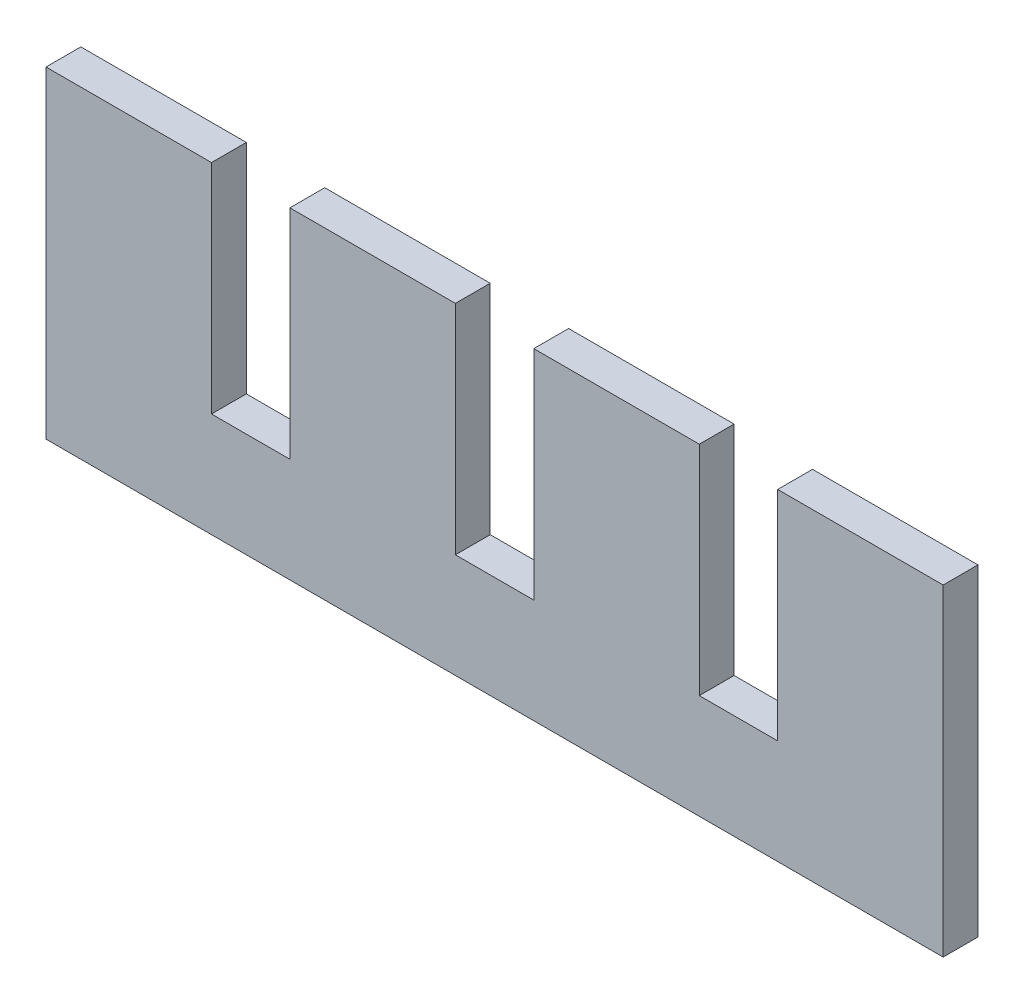
ISO-10303-21;
HEADER;
FILE_DESCRIPTION(('STEP AP214'),'2;1');
FILE_NAME('part.step','',(''),(''),'','','');
FILE_SCHEMA(('AUTOMOTIVE_DESIGN { 1 0 10303 214 1 1 1 1 }'));
ENDSEC;
DATA;
#1=APPLICATION_CONTEXT('core data for automotive mechanical design processes');
#2=APPLICATION_PROTOCOL_DEFINITION('international standard','automotive_design',2000,#1);
#3=PRODUCT_CONTEXT('',#1,'mechanical');
#4=PRODUCT('Part','Part','',(#3));
#5=PRODUCT_RELATED_PRODUCT_CATEGORY('part','',(#4));
#6=PRODUCT_DEFINITION_FORMATION('','',#4);
#7=PRODUCT_DEFINITION_CONTEXT('part definition',#1,'design');
#8=PRODUCT_DEFINITION('design','',#6,#7);
#9=PRODUCT_DEFINITION_SHAPE('','',#8);
#10=(LENGTH_UNIT() NAMED_UNIT(*) SI_UNIT(.MILLI.,.METRE.));
#11=(NAMED_UNIT(*) PLANE_ANGLE_UNIT() SI_UNIT($,.RADIAN.));
#12=(NAMED_UNIT(*) SI_UNIT($,.STERADIAN.) SOLID_ANGLE_UNIT());
#13=UNCERTAINTY_MEASURE_WITH_UNIT(LENGTH_MEASURE(1.E-05),#10,'distance_accuracy_value','');
#14=(GEOMETRIC_REPRESENTATION_CONTEXT(3) GLOBAL_UNCERTAINTY_ASSIGNED_CONTEXT((#13)) GLOBAL_UNIT_ASSIGNED_CONTEXT((#10,
#11,#12)) REPRESENTATION_CONTEXT('',''));
#15=CARTESIAN_POINT('',(0.,0.,0.));
#16=DIRECTION('',(0.,0.,1.));
#17=DIRECTION('',(1.,0.,0.));
#18=AXIS2_PLACEMENT_3D('',#15,#16,#17);
#19=CARTESIAN_POINT('',(6.55,3.7,0.25));
#20=DIRECTION('',(0.,1.,0.));
#21=DIRECTION('',(1.,0.,0.));
#22=AXIS2_PLACEMENT_3D('',#19,#20,#21);
#23=PLANE('',#22);
#24=DIRECTION('',(0.,0.,-1.));
#25=VECTOR('',#24,1.);
#26=CARTESIAN_POINT('',(7.5,3.7,0.45));
#27=LINE('',#26,#25);
#28=CARTESIAN_POINT('',(7.5,3.7,0.45));
#29=VERTEX_POINT('',#28);
#30=CARTESIAN_POINT('',(7.50000000024103,3.7,0.05));
#31=VERTEX_POINT('',#30);
#32=EDGE_CURVE('E11',#29,#31,#27,.T.);
#33=ORIENTED_EDGE('',*,*,#32,.T.);
#34=DIRECTION('',(-1.,0.,0.));
#35=VECTOR('',#34,1.);
#36=CARTESIAN_POINT('',(7.50000000022217,3.7,0.05));
#37=LINE('',#36,#35);
#38=CARTESIAN_POINT('',(5.6,3.7,0.05));
#39=VERTEX_POINT('',#38);
#40=EDGE_CURVE('E310',#31,#39,#37,.T.);
#41=ORIENTED_EDGE('',*,*,#40,.T.);
#42=DIRECTION('',(0.,0.,1.));
#43=VECTOR('',#42,1.);
#44=CARTESIAN_POINT('',(5.6,3.7,0.05));
#45=LINE('',#44,#43);
#46=CARTESIAN_POINT('',(5.599999999407,3.7,0.45));
#47=VERTEX_POINT('',#46);
#48=EDGE_CURVE('E275',#39,#47,#45,.T.);
#49=ORIENTED_EDGE('',*,*,#48,.T.);
#50=DIRECTION('',(1.,0.,0.));
#51=VECTOR('',#50,1.);
#52=CARTESIAN_POINT('',(5.599999999407,3.7,0.45));
#53=LINE('',#52,#51);
#54=EDGE_CURVE('E269',#47,#29,#53,.T.);
#55=ORIENTED_EDGE('',*,*,#54,.T.);
#56=EDGE_LOOP('',(#33,#41,#49,#55));
#57=FACE_BOUND('',#56,.T.);
#58=ADVANCED_FACE('F17',(#57),#23,.T.);
#59=CARTESIAN_POINT('',(7.5,2.45,0.25));
#60=DIRECTION('',(1.,0.,0.));
#61=DIRECTION('',(0.,1.,0.));
#62=AXIS2_PLACEMENT_3D('',#59,#60,#61);
#63=PLANE('',#62);
#64=DIRECTION('',(0.,1.,0.));
#65=VECTOR('',#64,1.);
#66=CARTESIAN_POINT('',(7.5,1.19999999984411,0.45));
#67=LINE('',#66,#65);
#68=CARTESIAN_POINT('',(7.50000000020336,1.2,0.45));
#69=VERTEX_POINT('',#68);
#70=EDGE_CURVE('E259',#69,#29,#67,.T.);
#71=ORIENTED_EDGE('',*,*,#70,.F.);
#72=DIRECTION('',(0.,0.,-1.));
#73=VECTOR('',#72,1.);
#74=CARTESIAN_POINT('',(7.50000000018489,1.2,0.45));
#75=LINE('',#74,#73);
#76=CARTESIAN_POINT('',(7.5,1.19999999985539,0.05));
#77=VERTEX_POINT('',#76);
#78=EDGE_CURVE('E26',#69,#77,#75,.T.);
#79=ORIENTED_EDGE('',*,*,#78,.T.);
#80=DIRECTION('',(0.,-1.,0.));
#81=VECTOR('',#80,1.);
#82=CARTESIAN_POINT('',(7.5,3.7,0.05));
#83=LINE('',#82,#81);
#84=EDGE_CURVE('E313',#31,#77,#83,.T.);
#85=ORIENTED_EDGE('',*,*,#84,.F.);
#86=ORIENTED_EDGE('',*,*,#32,.F.);
#87=EDGE_LOOP('',(#71,#79,#85,#86));
#88=FACE_BOUND('',#87,.T.);
#89=ADVANCED_FACE('F19',(#88),#63,.T.);
#90=CARTESIAN_POINT('',(7.95,1.2,0.25));
#91=DIRECTION('',(0.,1.,0.));
#92=DIRECTION('',(1.,0.,0.));
#93=AXIS2_PLACEMENT_3D('',#90,#91,#92);
#94=PLANE('',#93);
#95=DIRECTION('',(-1.,0.,0.));
#96=VECTOR('',#95,1.);
#97=CARTESIAN_POINT('',(8.400000000637,1.2,0.45));
#98=LINE('',#97,#96);
#99=CARTESIAN_POINT('',(8.4,1.19999999987772,0.45));
#100=VERTEX_POINT('',#99);
#101=EDGE_CURVE('E211',#100,#69,#98,.T.);
#102=ORIENTED_EDGE('',*,*,#101,.F.);
#103=DIRECTION('',(0.,0.,-1.));
#104=VECTOR('',#103,1.);
#105=CARTESIAN_POINT('',(8.4,1.19999999988911,0.45));
#106=LINE('',#105,#104);
#107=CARTESIAN_POINT('',(8.400000000637,1.2,0.05));
#108=VERTEX_POINT('',#107);
#109=EDGE_CURVE('E224',#100,#108,#106,.T.);
#110=ORIENTED_EDGE('',*,*,#109,.T.);
#111=DIRECTION('',(1.,0.,0.));
#112=VECTOR('',#111,1.);
#113=CARTESIAN_POINT('',(7.50000000018489,1.2,0.05));
#114=LINE('',#113,#112);
#115=EDGE_CURVE('E317',#77,#108,#114,.T.);
#116=ORIENTED_EDGE('',*,*,#115,.F.);
#117=ORIENTED_EDGE('',*,*,#78,.F.);
#118=EDGE_LOOP('',(#102,#110,#116,#117));
#119=FACE_BOUND('',#118,.T.);
#120=ADVANCED_FACE('F373',(#119),#94,.T.);
#121=CARTESIAN_POINT('',(8.4,2.45,0.25));
#122=DIRECTION('',(1.,0.,0.));
#123=DIRECTION('',(0.,1.,0.));
#124=AXIS2_PLACEMENT_3D('',#121,#122,#123);
#125=PLANE('',#124);
#126=DIRECTION('',(0.,-1.,0.));
#127=VECTOR('',#126,1.);
#128=CARTESIAN_POINT('',(8.4,3.7,0.45));
#129=LINE('',#128,#127);
#130=CARTESIAN_POINT('',(8.400000000637,3.7,0.45));
#131=VERTEX_POINT('',#130);
#132=EDGE_CURVE('E208',#131,#100,#129,.T.);
#133=ORIENTED_EDGE('',*,*,#132,.F.);
#134=DIRECTION('',(0.,0.,1.));
#135=VECTOR('',#134,1.);
#136=CARTESIAN_POINT('',(8.4,3.7,0.05));
#137=LINE('',#136,#135);
#138=CARTESIAN_POINT('',(8.4,3.7,0.05));
#139=VERTEX_POINT('',#138);
#140=EDGE_CURVE('E221',#139,#131,#137,.T.);
#141=ORIENTED_EDGE('',*,*,#140,.F.);
#142=DIRECTION('',(0.,1.,0.));
#143=VECTOR('',#142,1.);
#144=CARTESIAN_POINT('',(8.4,1.19999999988911,0.05));
#145=LINE('',#144,#143);
#146=EDGE_CURVE('E250',#108,#139,#145,.T.);
#147=ORIENTED_EDGE('',*,*,#146,.F.);
#148=ORIENTED_EDGE('',*,*,#109,.F.);
#149=EDGE_LOOP('',(#133,#141,#147,#148));
#150=FACE_BOUND('',#149,.T.);
#151=ADVANCED_FACE('F370',(#150),#125,.F.);
#152=CARTESIAN_POINT('',(9.35,3.7,0.25));
#153=DIRECTION('',(0.,1.,0.));
#154=DIRECTION('',(1.,0.,0.));
#155=AXIS2_PLACEMENT_3D('',#152,#153,#154);
#156=PLANE('',#155);
#157=DIRECTION('',(0.,0.,1.));
#158=VECTOR('',#157,1.);
#159=CARTESIAN_POINT('',(10.3,3.7,0.05));
#160=LINE('',#159,#158);
#161=CARTESIAN_POINT('',(10.3,3.7,0.05));
#162=VERTEX_POINT('',#161);
#163=CARTESIAN_POINT('',(10.3,3.7,0.45));
#164=VERTEX_POINT('',#163);
#165=EDGE_CURVE('E225',#162,#164,#160,.T.);
#166=ORIENTED_EDGE('',*,*,#165,.F.);
#167=DIRECTION('',(1.,0.,0.));
#168=VECTOR('',#167,1.);
#169=CARTESIAN_POINT('',(8.400000000637,3.7,0.05));
#170=LINE('',#169,#168);
#171=EDGE_CURVE('E245',#139,#162,#170,.T.);
#172=ORIENTED_EDGE('',*,*,#171,.F.);
#173=ORIENTED_EDGE('',*,*,#140,.T.);
#174=DIRECTION('',(-1.,0.,0.));
#175=VECTOR('',#174,1.);
#176=CARTESIAN_POINT('',(10.3,3.7,0.45));
#177=LINE('',#176,#175);
#178=EDGE_CURVE('E212',#164,#131,#177,.T.);
#179=ORIENTED_EDGE('',*,*,#178,.F.);
#180=EDGE_LOOP('',(#166,#172,#173,#179));
#181=FACE_BOUND('',#180,.T.);
#182=ADVANCED_FACE('F366',(#181),#156,.T.);
#183=CARTESIAN_POINT('',(10.3,1.85,0.25));
#184=DIRECTION('',(1.,0.,0.));
#185=DIRECTION('',(0.,1.,0.));
#186=AXIS2_PLACEMENT_3D('',#183,#184,#185);
#187=PLANE('',#186);
#188=DIRECTION('',(0.,1.,0.));
#189=VECTOR('',#188,1.);
#190=CARTESIAN_POINT('',(10.3,0.,0.45));
#191=LINE('',#190,#189);
#192=CARTESIAN_POINT('',(10.3,0.,0.45));
#193=VERTEX_POINT('',#192);
#194=EDGE_CURVE('E214',#193,#164,#191,.T.);
#195=ORIENTED_EDGE('',*,*,#194,.F.);
#196=DIRECTION('',(0.,0.,1.));
#197=VECTOR('',#196,1.);
#198=CARTESIAN_POINT('',(10.3,0.,0.05));
#199=LINE('',#198,#197);
#200=CARTESIAN_POINT('',(10.3,0.,0.05));
#201=VERTEX_POINT('',#200);
#202=EDGE_CURVE('E343',#201,#193,#199,.T.);
#203=ORIENTED_EDGE('',*,*,#202,.F.);
#204=DIRECTION('',(0.,1.,0.));
#205=VECTOR('',#204,1.);
#206=CARTESIAN_POINT('',(10.3,0.,0.05));
#207=LINE('',#206,#205);
#208=EDGE_CURVE('E249',#201,#162,#207,.T.);
#209=ORIENTED_EDGE('',*,*,#208,.T.);
#210=ORIENTED_EDGE('',*,*,#165,.T.);
#211=EDGE_LOOP('',(#195,#203,#209,#210));
#212=FACE_BOUND('',#211,.T.);
#213=ADVANCED_FACE('F358',(#212),#187,.T.);
#214=CARTESIAN_POINT('',(5.15,0.,0.25));
#215=DIRECTION('',(0.,1.,0.));
#216=DIRECTION('',(1.,0.,0.));
#217=AXIS2_PLACEMENT_3D('',#214,#215,#216);
#218=PLANE('',#217);
#219=DIRECTION('',(-1.,0.,0.));
#220=VECTOR('',#219,1.);
#221=CARTESIAN_POINT('',(10.3,0.,0.45));
#222=LINE('',#221,#220);
#223=CARTESIAN_POINT('',(0.,0.,0.45));
#224=VERTEX_POINT('',#223);
#225=EDGE_CURVE('E218',#193,#224,#222,.T.);
#226=ORIENTED_EDGE('',*,*,#225,.T.);
#227=DIRECTION('',(0.,0.,-1.));
#228=VECTOR('',#227,1.);
#229=CARTESIAN_POINT('',(0.,0.,0.45));
#230=LINE('',#229,#228);
#231=CARTESIAN_POINT('',(0.,0.,0.05));
#232=VERTEX_POINT('',#231);
#233=EDGE_CURVE('E341',#224,#232,#230,.T.);
#234=ORIENTED_EDGE('',*,*,#233,.T.);
#235=DIRECTION('',(1.,0.,0.));
#236=VECTOR('',#235,1.);
#237=CARTESIAN_POINT('',(0.,0.,0.05));
#238=LINE('',#237,#236);
#239=EDGE_CURVE('E327',#232,#201,#238,.T.);
#240=ORIENTED_EDGE('',*,*,#239,.T.);
#241=ORIENTED_EDGE('',*,*,#202,.T.);
#242=EDGE_LOOP('',(#226,#234,#240,#241));
#243=FACE_BOUND('',#242,.T.);
#244=ADVANCED_FACE('F354',(#243),#218,.F.);
#245=CARTESIAN_POINT('',(0.,1.85,0.25));
#246=DIRECTION('',(1.,0.,0.));
#247=DIRECTION('',(0.,1.,0.));
#248=AXIS2_PLACEMENT_3D('',#245,#246,#247);
#249=PLANE('',#248);
#250=DIRECTION('',(0.,1.,0.));
#251=VECTOR('',#250,1.);
#252=CARTESIAN_POINT('',(0.,0.,0.05));
#253=LINE('',#252,#251);
#254=CARTESIAN_POINT('',(0.,3.7,0.05));
#255=VERTEX_POINT('',#254);
#256=EDGE_CURVE('E331',#232,#255,#253,.T.);
#257=ORIENTED_EDGE('',*,*,#256,.F.);
#258=ORIENTED_EDGE('',*,*,#233,.F.);
#259=DIRECTION('',(0.,-1.,0.));
#260=VECTOR('',#259,1.);
#261=CARTESIAN_POINT('',(0.,3.7,0.45));
#262=LINE('',#261,#260);
#263=CARTESIAN_POINT('',(0.,3.7,0.45));
#264=VERTEX_POINT('',#263);
#265=EDGE_CURVE('E228',#264,#224,#262,.T.);
#266=ORIENTED_EDGE('',*,*,#265,.F.);
#267=DIRECTION('',(0.,0.,1.));
#268=VECTOR('',#267,1.);
#269=CARTESIAN_POINT('',(0.,3.7,0.05));
#270=LINE('',#269,#268);
#271=EDGE_CURVE('E48',#255,#264,#270,.T.);
#272=ORIENTED_EDGE('',*,*,#271,.F.);
#273=EDGE_LOOP('',(#257,#258,#266,#272));
#274=FACE_BOUND('',#273,.T.);
#275=ADVANCED_FACE('F359',(#274),#249,.F.);
#276=CARTESIAN_POINT('',(0.95,3.7,0.25));
#277=DIRECTION('',(0.,1.,0.));
#278=DIRECTION('',(1.,0.,0.));
#279=AXIS2_PLACEMENT_3D('',#276,#277,#278);
#280=PLANE('',#279);
#281=ORIENTED_EDGE('',*,*,#271,.T.);
#282=DIRECTION('',(1.,0.,0.));
#283=VECTOR('',#282,1.);
#284=CARTESIAN_POINT('',(0.,3.7,0.45));
#285=LINE('',#284,#283);
#286=CARTESIAN_POINT('',(1.9,3.7,0.45));
#287=VERTEX_POINT('',#286);
#288=EDGE_CURVE('E178',#264,#287,#285,.T.);
#289=ORIENTED_EDGE('',*,*,#288,.T.);
#290=DIRECTION('',(0.,0.,-1.));
#291=VECTOR('',#290,1.);
#292=CARTESIAN_POINT('',(1.9,3.7,0.45));
#293=LINE('',#292,#291);
#294=CARTESIAN_POINT('',(1.89999999948269,3.7,0.05));
#295=VERTEX_POINT('',#294);
#296=EDGE_CURVE('E38',#287,#295,#293,.T.);
#297=ORIENTED_EDGE('',*,*,#296,.T.);
#298=DIRECTION('',(-1.,0.,0.));
#299=VECTOR('',#298,1.);
#300=CARTESIAN_POINT('',(1.8999999995225,3.7,0.05));
#301=LINE('',#300,#299);
#302=EDGE_CURVE('E265',#295,#255,#301,.T.);
#303=ORIENTED_EDGE('',*,*,#302,.T.);
#304=EDGE_LOOP('',(#281,#289,#297,#303));
#305=FACE_BOUND('',#304,.T.);
#306=ADVANCED_FACE('F583',(#305),#280,.T.);
#307=CARTESIAN_POINT('',(1.9,2.45,0.25));
#308=DIRECTION('',(1.,0.,0.));
#309=DIRECTION('',(0.,1.,0.));
#310=AXIS2_PLACEMENT_3D('',#307,#308,#309);
#311=PLANE('',#310);
#312=DIRECTION('',(0.,1.,0.));
#313=VECTOR('',#312,1.);
#314=CARTESIAN_POINT('',(1.9,1.19999999984411,0.45));
#315=LINE('',#314,#313);
#316=CARTESIAN_POINT('',(1.9,1.2,0.45));
#317=VERTEX_POINT('',#316);
#318=EDGE_CURVE('E169',#317,#287,#315,.T.);
#319=ORIENTED_EDGE('',*,*,#318,.F.);
#320=DIRECTION('',(0.,0.,-1.));
#321=VECTOR('',#320,1.);
#322=CARTESIAN_POINT('',(1.89999999960189,1.2,0.45));
#323=LINE('',#322,#321);
#324=CARTESIAN_POINT('',(1.89999999956219,1.2,0.05));
#325=VERTEX_POINT('',#324);
#326=EDGE_CURVE('E172',#317,#325,#323,.T.);
#327=ORIENTED_EDGE('',*,*,#326,.T.);
#328=DIRECTION('',(0.,-1.,0.));
#329=VECTOR('',#328,1.);
#330=CARTESIAN_POINT('',(1.9,3.7,0.05));
#331=LINE('',#330,#329);
#332=EDGE_CURVE('E262',#295,#325,#331,.T.);
#333=ORIENTED_EDGE('',*,*,#332,.F.);
#334=ORIENTED_EDGE('',*,*,#296,.F.);
#335=EDGE_LOOP('',(#319,#327,#333,#334));
#336=FACE_BOUND('',#335,.T.);
#337=ADVANCED_FACE('F171',(#336),#311,.T.);
#338=CARTESIAN_POINT('',(5.15,1.85,0.05));
#339=DIRECTION('',(0.,0.,1.));
#340=DIRECTION('',(1.,0.,0.));
#341=AXIS2_PLACEMENT_3D('',#338,#339,#340);
#342=PLANE('',#341);
#343=DIRECTION('',(0.,1.,0.));
#344=VECTOR('',#343,1.);
#345=CARTESIAN_POINT('',(2.8,1.19999999988911,0.05));
#346=LINE('',#345,#344);
#347=CARTESIAN_POINT('',(2.8,1.2,0.05));
#348=VERTEX_POINT('',#347);
#349=CARTESIAN_POINT('',(2.799999999703,3.7,0.05));
#350=VERTEX_POINT('',#349);
#351=EDGE_CURVE('E307',#348,#350,#346,.T.);
#352=ORIENTED_EDGE('',*,*,#351,.T.);
#353=DIRECTION('',(-1.,0.,0.));
#354=VECTOR('',#353,1.);
#355=CARTESIAN_POINT('',(4.70000000044417,3.7,0.05));
#356=LINE('',#355,#354);
#357=CARTESIAN_POINT('',(4.7,3.7,0.05));
#358=VERTEX_POINT('',#357);
#359=EDGE_CURVE('E303',#358,#350,#356,.T.);
#360=ORIENTED_EDGE('',*,*,#359,.F.);
#361=DIRECTION('',(0.,-1.,0.));
#362=VECTOR('',#361,1.);
#363=CARTESIAN_POINT('',(4.7,3.7,0.05));
#364=LINE('',#363,#362);
#365=CARTESIAN_POINT('',(4.70000000040703,1.2,0.05));
#366=VERTEX_POINT('',#365);
#367=EDGE_CURVE('E293',#358,#366,#364,.T.);
#368=ORIENTED_EDGE('',*,*,#367,.T.);
#369=DIRECTION('',(1.,0.,0.));
#370=VECTOR('',#369,1.);
#371=CARTESIAN_POINT('',(4.70000000036989,1.2,0.05));
#372=LINE('',#371,#370);
#373=CARTESIAN_POINT('',(5.6,1.19999999987789,0.05));
#374=VERTEX_POINT('',#373);
#375=EDGE_CURVE('E286',#366,#374,#372,.T.);
#376=ORIENTED_EDGE('',*,*,#375,.T.);
#377=DIRECTION('',(0.,1.,0.));
#378=VECTOR('',#377,1.);
#379=CARTESIAN_POINT('',(5.6,1.19999999988911,0.05));
#380=LINE('',#379,#378);
#381=EDGE_CURVE('E278',#374,#39,#380,.T.);
#382=ORIENTED_EDGE('',*,*,#381,.T.);
#383=ORIENTED_EDGE('',*,*,#40,.F.);
#384=ORIENTED_EDGE('',*,*,#84,.T.);
#385=ORIENTED_EDGE('',*,*,#115,.T.);
#386=ORIENTED_EDGE('',*,*,#146,.T.);
#387=ORIENTED_EDGE('',*,*,#171,.T.);
#388=ORIENTED_EDGE('',*,*,#208,.F.);
#389=ORIENTED_EDGE('',*,*,#239,.F.);
#390=ORIENTED_EDGE('',*,*,#256,.T.);
#391=ORIENTED_EDGE('',*,*,#302,.F.);
#392=ORIENTED_EDGE('',*,*,#332,.T.);
#393=DIRECTION('',(1.,0.,0.));
#394=VECTOR('',#393,1.);
#395=CARTESIAN_POINT('',(1.89999999960189,1.2,0.05));
#396=LINE('',#395,#394);
#397=EDGE_CURVE('E187',#325,#348,#396,.T.);
#398=ORIENTED_EDGE('',*,*,#397,.T.);
#399=EDGE_LOOP('',(#352,#360,#368,#376,#382,#383,#384,#385,#386,#387,#388,#389,#390,#391,#392,#398));
#400=FACE_BOUND('',#399,.T.);
#401=ADVANCED_FACE('F362',(#400),#342,.F.);
#402=CARTESIAN_POINT('',(2.8,2.45,0.25));
#403=DIRECTION('',(1.,0.,0.));
#404=DIRECTION('',(0.,1.,0.));
#405=AXIS2_PLACEMENT_3D('',#402,#403,#404);
#406=PLANE('',#405);
#407=DIRECTION('',(0.,-1.,0.));
#408=VECTOR('',#407,1.);
#409=CARTESIAN_POINT('',(2.8,3.7,0.45));
#410=LINE('',#409,#408);
#411=CARTESIAN_POINT('',(2.799999999703,3.7,0.45));
#412=VERTEX_POINT('',#411);
#413=CARTESIAN_POINT('',(2.8,1.19999999987772,0.45));
#414=VERTEX_POINT('',#413);
#415=EDGE_CURVE('E179',#412,#414,#410,.T.);
#416=ORIENTED_EDGE('',*,*,#415,.F.);
#417=DIRECTION('',(0.,0.,1.));
#418=VECTOR('',#417,1.);
#419=CARTESIAN_POINT('',(2.8,3.7,0.05));
#420=LINE('',#419,#418);
#421=EDGE_CURVE('E300',#350,#412,#420,.T.);
#422=ORIENTED_EDGE('',*,*,#421,.F.);
#423=ORIENTED_EDGE('',*,*,#351,.F.);
#424=DIRECTION('',(0.,0.,-1.));
#425=VECTOR('',#424,1.);
#426=CARTESIAN_POINT('',(2.8,1.19999999988911,0.45));
#427=LINE('',#426,#425);
#428=EDGE_CURVE('E197',#414,#348,#427,.T.);
#429=ORIENTED_EDGE('',*,*,#428,.F.);
#430=EDGE_LOOP('',(#416,#422,#423,#429));
#431=FACE_BOUND('',#430,.T.);
#432=ADVANCED_FACE('F535',(#431),#406,.F.);
#433=CARTESIAN_POINT('',(3.75,3.7,0.25));
#434=DIRECTION('',(0.,1.,0.));
#435=DIRECTION('',(1.,0.,0.));
#436=AXIS2_PLACEMENT_3D('',#433,#434,#435);
#437=PLANE('',#436);
#438=ORIENTED_EDGE('',*,*,#421,.T.);
#439=DIRECTION('',(1.,0.,0.));
#440=VECTOR('',#439,1.);
#441=CARTESIAN_POINT('',(2.799999999703,3.7,0.45));
#442=LINE('',#441,#440);
#443=CARTESIAN_POINT('',(4.7,3.7,0.45));
#444=VERTEX_POINT('',#443);
#445=EDGE_CURVE('E236',#412,#444,#442,.T.);
#446=ORIENTED_EDGE('',*,*,#445,.T.);
#447=DIRECTION('',(0.,0.,-1.));
#448=VECTOR('',#447,1.);
#449=CARTESIAN_POINT('',(4.7,3.7,0.45));
#450=LINE('',#449,#448);
#451=EDGE_CURVE('E296',#444,#358,#450,.T.);
#452=ORIENTED_EDGE('',*,*,#451,.T.);
#453=ORIENTED_EDGE('',*,*,#359,.T.);
#454=EDGE_LOOP('',(#438,#446,#452,#453));
#455=FACE_BOUND('',#454,.T.);
#456=ADVANCED_FACE('F540',(#455),#437,.T.);
#457=CARTESIAN_POINT('',(4.7,2.45,0.25));
#458=DIRECTION('',(1.,0.,0.));
#459=DIRECTION('',(0.,1.,0.));
#460=AXIS2_PLACEMENT_3D('',#457,#458,#459);
#461=PLANE('',#460);
#462=DIRECTION('',(0.,1.,0.));
#463=VECTOR('',#462,1.);
#464=CARTESIAN_POINT('',(4.7,1.19999999984411,0.45));
#465=LINE('',#464,#463);
#466=CARTESIAN_POINT('',(4.70000000040686,1.2,0.45));
#467=VERTEX_POINT('',#466);
#468=EDGE_CURVE('E232',#467,#444,#465,.T.);
#469=ORIENTED_EDGE('',*,*,#468,.F.);
#470=DIRECTION('',(0.,0.,-1.));
#471=VECTOR('',#470,1.);
#472=CARTESIAN_POINT('',(4.70000000036989,1.2,0.45));
#473=LINE('',#472,#471);
#474=EDGE_CURVE('E289',#467,#366,#473,.T.);
#475=ORIENTED_EDGE('',*,*,#474,.T.);
#476=ORIENTED_EDGE('',*,*,#367,.F.);
#477=ORIENTED_EDGE('',*,*,#451,.F.);
#478=EDGE_LOOP('',(#469,#475,#476,#477));
#479=FACE_BOUND('',#478,.T.);
#480=ADVANCED_FACE('F550',(#479),#461,.T.);
#481=CARTESIAN_POINT('',(5.15,1.2,0.25));
#482=DIRECTION('',(0.,1.,0.));
#483=DIRECTION('',(1.,0.,0.));
#484=AXIS2_PLACEMENT_3D('',#481,#482,#483);
#485=PLANE('',#484);
#486=DIRECTION('',(-1.,0.,0.));
#487=VECTOR('',#486,1.);
#488=CARTESIAN_POINT('',(5.599999999407,1.2,0.45));
#489=LINE('',#488,#487);
#490=CARTESIAN_POINT('',(5.6,1.2,0.45));
#491=VERTEX_POINT('',#490);
#492=EDGE_CURVE('E206',#491,#467,#489,.T.);
#493=ORIENTED_EDGE('',*,*,#492,.F.);
#494=DIRECTION('',(0.,0.,-1.));
#495=VECTOR('',#494,1.);
#496=CARTESIAN_POINT('',(5.6,1.19999999988911,0.45));
#497=LINE('',#496,#495);
#498=EDGE_CURVE('E282',#491,#374,#497,.T.);
#499=ORIENTED_EDGE('',*,*,#498,.T.);
#500=ORIENTED_EDGE('',*,*,#375,.F.);
#501=ORIENTED_EDGE('',*,*,#474,.F.);
#502=EDGE_LOOP('',(#493,#499,#500,#501));
#503=FACE_BOUND('',#502,.T.);
#504=ADVANCED_FACE('F388',(#503),#485,.T.);
#505=CARTESIAN_POINT('',(5.6,2.45,0.25));
#506=DIRECTION('',(1.,0.,0.));
#507=DIRECTION('',(0.,1.,0.));
#508=AXIS2_PLACEMENT_3D('',#505,#506,#507);
#509=PLANE('',#508);
#510=DIRECTION('',(0.,-1.,0.));
#511=VECTOR('',#510,1.);
#512=CARTESIAN_POINT('',(5.6,3.7,0.45));
#513=LINE('',#512,#511);
#514=EDGE_CURVE('E189',#47,#491,#513,.T.);
#515=ORIENTED_EDGE('',*,*,#514,.F.);
#516=ORIENTED_EDGE('',*,*,#48,.F.);
#517=ORIENTED_EDGE('',*,*,#381,.F.);
#518=ORIENTED_EDGE('',*,*,#498,.F.);
#519=EDGE_LOOP('',(#515,#516,#517,#518));
#520=FACE_BOUND('',#519,.T.);
#521=ADVANCED_FACE('F383',(#520),#509,.F.);
#522=CARTESIAN_POINT('',(5.15,1.85,0.45));
#523=DIRECTION('',(0.,0.,1.));
#524=DIRECTION('',(1.,0.,0.));
#525=AXIS2_PLACEMENT_3D('',#522,#523,#524);
#526=PLANE('',#525);
#527=ORIENTED_EDGE('',*,*,#514,.T.);
#528=ORIENTED_EDGE('',*,*,#492,.T.);
#529=ORIENTED_EDGE('',*,*,#468,.T.);
#530=ORIENTED_EDGE('',*,*,#445,.F.);
#531=ORIENTED_EDGE('',*,*,#415,.T.);
#532=DIRECTION('',(-1.,0.,0.));
#533=VECTOR('',#532,1.);
#534=CARTESIAN_POINT('',(2.799999999703,1.2,0.45));
#535=LINE('',#534,#533);
#536=EDGE_CURVE('E185',#414,#317,#535,.T.);
#537=ORIENTED_EDGE('',*,*,#536,.T.);
#538=ORIENTED_EDGE('',*,*,#318,.T.);
#539=ORIENTED_EDGE('',*,*,#288,.F.);
#540=ORIENTED_EDGE('',*,*,#265,.T.);
#541=ORIENTED_EDGE('',*,*,#225,.F.);
#542=ORIENTED_EDGE('',*,*,#194,.T.);
#543=ORIENTED_EDGE('',*,*,#178,.T.);
#544=ORIENTED_EDGE('',*,*,#132,.T.);
#545=ORIENTED_EDGE('',*,*,#101,.T.);
#546=ORIENTED_EDGE('',*,*,#70,.T.);
#547=ORIENTED_EDGE('',*,*,#54,.F.);
#548=EDGE_LOOP('',(#527,#528,#529,#530,#531,#537,#538,#539,#540,#541,#542,#543,#544,#545,#546,#547));
#549=FACE_BOUND('',#548,.T.);
#550=ADVANCED_FACE('F192',(#549),#526,.T.);
#551=CARTESIAN_POINT('',(2.35,1.2,0.25));
#552=DIRECTION('',(0.,1.,0.));
#553=DIRECTION('',(1.,0.,0.));
#554=AXIS2_PLACEMENT_3D('',#551,#552,#553);
#555=PLANE('',#554);
#556=ORIENTED_EDGE('',*,*,#536,.F.);
#557=ORIENTED_EDGE('',*,*,#428,.T.);
#558=ORIENTED_EDGE('',*,*,#397,.F.);
#559=ORIENTED_EDGE('',*,*,#326,.F.);
#560=EDGE_LOOP('',(#556,#557,#558,#559));
#561=FACE_BOUND('',#560,.T.);
#562=ADVANCED_FACE('F183',(#561),#555,.T.);
#563=CLOSED_SHELL('',(#58,#89,#120,#151,#182,#213,#244,#275,#306,#337,#401,#432,#456,#480,#504,
#521,#550,#562));
#564=MANIFOLD_SOLID_BREP('B1',#563);
#565=ADVANCED_BREP_SHAPE_REPRESENTATION('',(#18,#564),#14);
#566=SHAPE_DEFINITION_REPRESENTATION(#9,#565);
ENDSEC;
END-ISO-10303-21;
